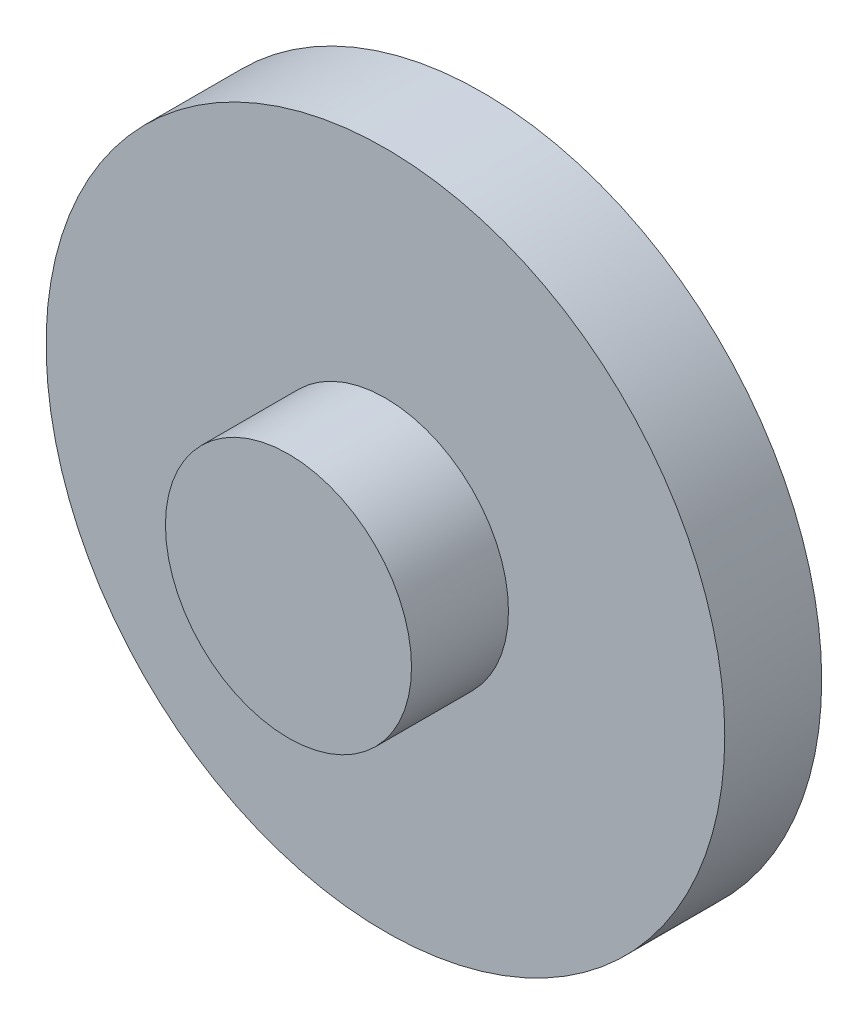
ISO-10303-21;
HEADER;
FILE_DESCRIPTION(('STEP AP214'),'2;1');
FILE_NAME('part.step','',(''),(''),'','','');
FILE_SCHEMA(('AUTOMOTIVE_DESIGN { 1 0 10303 214 1 1 1 1 }'));
ENDSEC;
DATA;
#1=APPLICATION_CONTEXT('core data for automotive mechanical design processes');
#2=APPLICATION_PROTOCOL_DEFINITION('international standard','automotive_design',2000,#1);
#3=PRODUCT_CONTEXT('',#1,'mechanical');
#4=PRODUCT('Part','Part','',(#3));
#5=PRODUCT_RELATED_PRODUCT_CATEGORY('part','',(#4));
#6=PRODUCT_DEFINITION_FORMATION('','',#4);
#7=PRODUCT_DEFINITION_CONTEXT('part definition',#1,'design');
#8=PRODUCT_DEFINITION('design','',#6,#7);
#9=PRODUCT_DEFINITION_SHAPE('','',#8);
#10=(LENGTH_UNIT() NAMED_UNIT(*) SI_UNIT(.MILLI.,.METRE.));
#11=(NAMED_UNIT(*) PLANE_ANGLE_UNIT() SI_UNIT($,.RADIAN.));
#12=(NAMED_UNIT(*) SI_UNIT($,.STERADIAN.) SOLID_ANGLE_UNIT());
#13=UNCERTAINTY_MEASURE_WITH_UNIT(LENGTH_MEASURE(1.E-05),#10,'distance_accuracy_value','');
#14=(GEOMETRIC_REPRESENTATION_CONTEXT(3) GLOBAL_UNCERTAINTY_ASSIGNED_CONTEXT((#13)) GLOBAL_UNIT_ASSIGNED_CONTEXT((#10,
#11,#12)) REPRESENTATION_CONTEXT('',''));
#15=CARTESIAN_POINT('',(0.,0.,0.));
#16=DIRECTION('',(0.,0.,1.));
#17=DIRECTION('',(1.,0.,0.));
#18=AXIS2_PLACEMENT_3D('',#15,#16,#17);
#19=CARTESIAN_POINT('',(0.,0.,5.));
#20=DIRECTION('',(0.,0.,1.));
#21=DIRECTION('',(1.,0.,0.));
#22=AXIS2_PLACEMENT_3D('',#19,#20,#21);
#23=PLANE('',#22);
#24=CARTESIAN_POINT('',(0.,0.,5.));
#25=DIRECTION('',(0.,0.,1.));
#26=DIRECTION('',(1.,0.,0.));
#27=AXIS2_PLACEMENT_3D('',#24,#25,#26);
#28=CIRCLE('',#27,17.5);
#29=CARTESIAN_POINT('',(17.5,0.,5.));
#30=VERTEX_POINT('',#29);
#31=EDGE_CURVE('E10',#30,#30,#28,.T.);
#32=ORIENTED_EDGE('',*,*,#31,.T.);
#33=EDGE_LOOP('',(#32));
#34=FACE_BOUND('',#33,.T.);
#35=CARTESIAN_POINT('',(0.,0.,5.));
#36=DIRECTION('',(0.,0.,1.));
#37=DIRECTION('',(1.,0.,0.));
#38=AXIS2_PLACEMENT_3D('',#35,#36,#37);
#39=CIRCLE('',#38,6.345);
#40=CARTESIAN_POINT('',(6.345,0.,5.));
#41=VERTEX_POINT('',#40);
#42=EDGE_CURVE('E42',#41,#41,#39,.T.);
#43=ORIENTED_EDGE('',*,*,#42,.F.);
#44=EDGE_LOOP('',(#43));
#45=FACE_BOUND('',#44,.T.);
#46=ADVANCED_FACE('F31',(#34,#45),#23,.T.);
#47=CARTESIAN_POINT('',(0.,0.,0.));
#48=DIRECTION('',(0.,0.,1.));
#49=DIRECTION('',(1.,0.,0.));
#50=AXIS2_PLACEMENT_3D('',#47,#48,#49);
#51=PLANE('',#50);
#52=CARTESIAN_POINT('',(0.,0.,0.));
#53=DIRECTION('',(0.,0.,1.));
#54=DIRECTION('',(1.,0.,0.));
#55=AXIS2_PLACEMENT_3D('',#52,#53,#54);
#56=CIRCLE('',#55,17.5);
#57=CARTESIAN_POINT('',(17.5,0.,0.));
#58=VERTEX_POINT('',#57);
#59=EDGE_CURVE('E35',#58,#58,#56,.T.);
#60=ORIENTED_EDGE('',*,*,#59,.F.);
#61=EDGE_LOOP('',(#60));
#62=FACE_BOUND('',#61,.T.);
#63=ADVANCED_FACE('F61',(#62),#51,.F.);
#64=CARTESIAN_POINT('',(0.,0.,5.));
#65=DIRECTION('',(0.,0.,-1.));
#66=DIRECTION('',(-1.,0.,0.));
#67=AXIS2_PLACEMENT_3D('',#64,#65,#66);
#68=CYLINDRICAL_SURFACE('',#67,17.5);
#69=ORIENTED_EDGE('',*,*,#31,.F.);
#70=EDGE_LOOP('',(#69));
#71=FACE_BOUND('',#70,.T.);
#72=ORIENTED_EDGE('',*,*,#59,.T.);
#73=EDGE_LOOP('',(#72));
#74=FACE_BOUND('',#73,.T.);
#75=ADVANCED_FACE('F33',(#71,#74),#68,.T.);
#76=CARTESIAN_POINT('',(0.,0.,10.));
#77=DIRECTION('',(0.,0.,-1.));
#78=DIRECTION('',(-1.,0.,0.));
#79=AXIS2_PLACEMENT_3D('',#76,#77,#78);
#80=CYLINDRICAL_SURFACE('',#79,6.345);
#81=ORIENTED_EDGE('',*,*,#42,.T.);
#82=EDGE_LOOP('',(#81));
#83=FACE_BOUND('',#82,.T.);
#84=CARTESIAN_POINT('',(0.,0.,10.));
#85=DIRECTION('',(0.,0.,1.));
#86=DIRECTION('',(1.,0.,0.));
#87=AXIS2_PLACEMENT_3D('',#84,#85,#86);
#88=CIRCLE('',#87,6.345);
#89=CARTESIAN_POINT('',(6.345,0.,10.));
#90=VERTEX_POINT('',#89);
#91=EDGE_CURVE('E46',#90,#90,#88,.T.);
#92=ORIENTED_EDGE('',*,*,#91,.F.);
#93=EDGE_LOOP('',(#92));
#94=FACE_BOUND('',#93,.T.);
#95=ADVANCED_FACE('F52',(#83,#94),#80,.T.);
#96=CARTESIAN_POINT('',(0.,0.,10.));
#97=DIRECTION('',(0.,0.,1.));
#98=DIRECTION('',(1.,0.,0.));
#99=AXIS2_PLACEMENT_3D('',#96,#97,#98);
#100=PLANE('',#99);
#101=ORIENTED_EDGE('',*,*,#91,.T.);
#102=EDGE_LOOP('',(#101));
#103=FACE_BOUND('',#102,.T.);
#104=ADVANCED_FACE('F50',(#103),#100,.T.);
#105=CLOSED_SHELL('',(#46,#63,#75,#95,#104));
#106=MANIFOLD_SOLID_BREP('B2',#105);
#107=ADVANCED_BREP_SHAPE_REPRESENTATION('',(#18,#106),#14);
#108=SHAPE_DEFINITION_REPRESENTATION(#9,#107);
ENDSEC;
END-ISO-10303-21;
